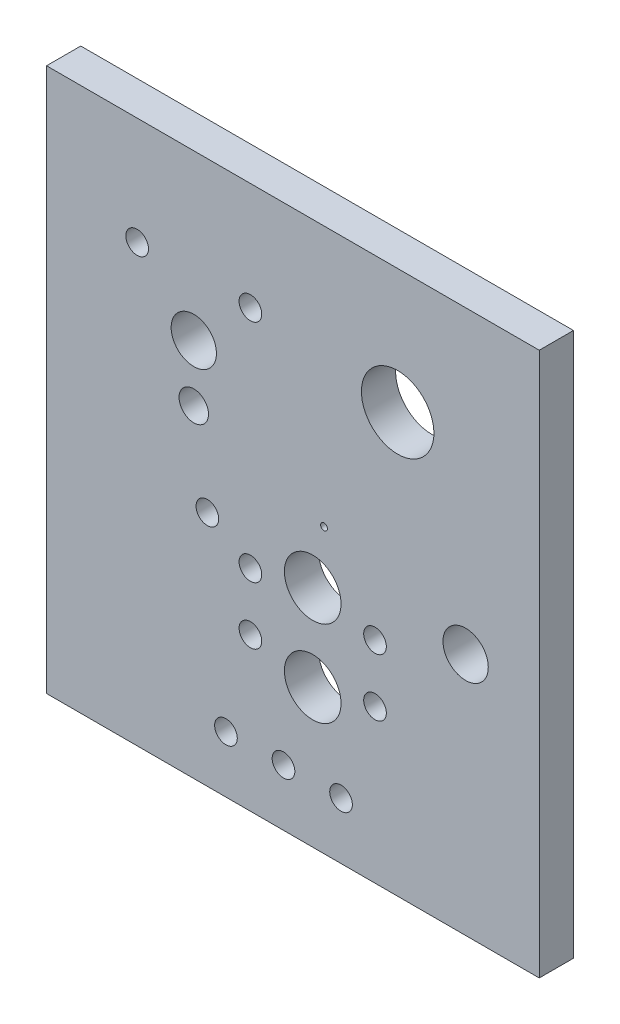
ISO-10303-21;
HEADER;
FILE_DESCRIPTION(('STEP AP214'),'2;1');
FILE_NAME('part.step','',(''),(''),'','','');
FILE_SCHEMA(('AUTOMOTIVE_DESIGN { 1 0 10303 214 1 1 1 1 }'));
ENDSEC;
DATA;
#1=APPLICATION_CONTEXT('core data for automotive mechanical design processes');
#2=APPLICATION_PROTOCOL_DEFINITION('international standard','automotive_design',2000,#1);
#3=PRODUCT_CONTEXT('',#1,'mechanical');
#4=PRODUCT('Part','Part','',(#3));
#5=PRODUCT_RELATED_PRODUCT_CATEGORY('part','',(#4));
#6=PRODUCT_DEFINITION_FORMATION('','',#4);
#7=PRODUCT_DEFINITION_CONTEXT('part definition',#1,'design');
#8=PRODUCT_DEFINITION('design','',#6,#7);
#9=PRODUCT_DEFINITION_SHAPE('','',#8);
#10=(LENGTH_UNIT() NAMED_UNIT(*) SI_UNIT(.MILLI.,.METRE.));
#11=(NAMED_UNIT(*) PLANE_ANGLE_UNIT() SI_UNIT($,.RADIAN.));
#12=(NAMED_UNIT(*) SI_UNIT($,.STERADIAN.) SOLID_ANGLE_UNIT());
#13=UNCERTAINTY_MEASURE_WITH_UNIT(LENGTH_MEASURE(1.E-05),#10,'distance_accuracy_value','');
#14=(GEOMETRIC_REPRESENTATION_CONTEXT(3) GLOBAL_UNCERTAINTY_ASSIGNED_CONTEXT((#13)) GLOBAL_UNIT_ASSIGNED_CONTEXT((#10,
#11,#12)) REPRESENTATION_CONTEXT('',''));
#15=CARTESIAN_POINT('',(0.,0.,0.));
#16=DIRECTION('',(0.,0.,1.));
#17=DIRECTION('',(1.,0.,0.));
#18=AXIS2_PLACEMENT_3D('',#15,#16,#17);
#19=CARTESIAN_POINT('',(155.5,-67.75,-0.046));
#20=DIRECTION('',(0.,0.,-1.));
#21=DIRECTION('',(0.,-1.,0.));
#22=AXIS2_PLACEMENT_3D('',#19,#20,#21);
#23=CYLINDRICAL_SURFACE('',#22,1.6);
#24=CARTESIAN_POINT('',(155.5,-67.75,0.));
#25=DIRECTION('',(0.,0.,-1.));
#26=DIRECTION('',(0.,-1.,0.));
#27=AXIS2_PLACEMENT_3D('',#24,#25,#26);
#28=CIRCLE('',#27,1.6);
#29=CARTESIAN_POINT('',(155.5,-69.35,0.));
#30=VERTEX_POINT('',#29);
#31=EDGE_CURVE('E402',#30,#30,#28,.T.);
#32=ORIENTED_EDGE('',*,*,#31,.T.);
#33=DIRECTION('',(0.,0.,1.));
#34=VECTOR('',#33,1.);
#35=CARTESIAN_POINT('',(155.5,-69.35,-0.046));
#36=LINE('',#35,#34);
#37=CARTESIAN_POINT('',(155.5,-69.35,1.51));
#38=VERTEX_POINT('',#37);
#39=EDGE_CURVE('E11',#30,#38,#36,.T.);
#40=ORIENTED_EDGE('',*,*,#39,.T.);
#41=CARTESIAN_POINT('',(155.5,-67.75,1.51));
#42=DIRECTION('',(0.,0.,-1.));
#43=DIRECTION('',(0.,-1.,0.));
#44=AXIS2_PLACEMENT_3D('',#41,#42,#43);
#45=CIRCLE('',#44,1.6);
#46=EDGE_CURVE('E326',#38,#38,#45,.T.);
#47=ORIENTED_EDGE('',*,*,#46,.F.);
#48=ORIENTED_EDGE('',*,*,#39,.F.);
#49=EDGE_LOOP('',(#32,#40,#47,#48));
#50=FACE_BOUND('',#49,.T.);
#51=ADVANCED_FACE('F16',(#50),#23,.F.);
#52=CARTESIAN_POINT('',(152.25,-73.75,-0.036));
#53=DIRECTION('',(0.,0.,-1.));
#54=DIRECTION('',(0.,-1.,0.));
#55=AXIS2_PLACEMENT_3D('',#52,#53,#54);
#56=CYLINDRICAL_SURFACE('',#55,0.15);
#57=CARTESIAN_POINT('',(152.25,-73.75,0.));
#58=DIRECTION('',(0.,0.,-1.));
#59=DIRECTION('',(0.,-1.,0.));
#60=AXIS2_PLACEMENT_3D('',#57,#58,#59);
#61=CIRCLE('',#60,0.15);
#62=CARTESIAN_POINT('',(152.25,-73.9,0.));
#63=VERTEX_POINT('',#62);
#64=EDGE_CURVE('E229',#63,#63,#61,.T.);
#65=ORIENTED_EDGE('',*,*,#64,.T.);
#66=DIRECTION('',(0.,0.,1.));
#67=VECTOR('',#66,1.);
#68=CARTESIAN_POINT('',(152.25,-73.9,-0.036));
#69=LINE('',#68,#67);
#70=CARTESIAN_POINT('',(152.25,-73.9,1.51));
#71=VERTEX_POINT('',#70);
#72=EDGE_CURVE('E27',#63,#71,#69,.T.);
#73=ORIENTED_EDGE('',*,*,#72,.T.);
#74=CARTESIAN_POINT('',(152.25,-73.75,1.51));
#75=DIRECTION('',(0.,0.,-1.));
#76=DIRECTION('',(0.,-1.,0.));
#77=AXIS2_PLACEMENT_3D('',#74,#75,#76);
#78=CIRCLE('',#77,0.15);
#79=EDGE_CURVE('E231',#71,#71,#78,.T.);
#80=ORIENTED_EDGE('',*,*,#79,.F.);
#81=ORIENTED_EDGE('',*,*,#72,.F.);
#82=EDGE_LOOP('',(#65,#73,#80,#81));
#83=FACE_BOUND('',#82,.T.);
#84=ADVANCED_FACE('F227',(#83),#56,.F.);
#85=CARTESIAN_POINT('',(149.,-67.,-0.046));
#86=DIRECTION('',(0.,0.,-1.));
#87=DIRECTION('',(0.,-1.,0.));
#88=AXIS2_PLACEMENT_3D('',#85,#86,#87);
#89=CYLINDRICAL_SURFACE('',#88,0.5);
#90=CARTESIAN_POINT('',(149.,-67.,0.));
#91=DIRECTION('',(0.,0.,-1.));
#92=DIRECTION('',(0.,-1.,0.));
#93=AXIS2_PLACEMENT_3D('',#90,#91,#92);
#94=CIRCLE('',#93,0.5);
#95=CARTESIAN_POINT('',(149.,-67.5,0.));
#96=VERTEX_POINT('',#95);
#97=EDGE_CURVE('E279',#96,#96,#94,.T.);
#98=ORIENTED_EDGE('',*,*,#97,.T.);
#99=DIRECTION('',(0.,0.,1.));
#100=VECTOR('',#99,1.);
#101=CARTESIAN_POINT('',(149.,-67.5,-0.046));
#102=LINE('',#101,#100);
#103=CARTESIAN_POINT('',(149.,-67.5,1.51));
#104=VERTEX_POINT('',#103);
#105=EDGE_CURVE('E233',#96,#104,#102,.T.);
#106=ORIENTED_EDGE('',*,*,#105,.T.);
#107=CARTESIAN_POINT('',(149.,-67.,1.51));
#108=DIRECTION('',(0.,0.,-1.));
#109=DIRECTION('',(0.,-1.,0.));
#110=AXIS2_PLACEMENT_3D('',#107,#108,#109);
#111=CIRCLE('',#110,0.5);
#112=EDGE_CURVE('E244',#104,#104,#111,.T.);
#113=ORIENTED_EDGE('',*,*,#112,.F.);
#114=ORIENTED_EDGE('',*,*,#105,.F.);
#115=EDGE_LOOP('',(#98,#106,#113,#114));
#116=FACE_BOUND('',#115,.T.);
#117=ADVANCED_FACE('F546',(#116),#89,.F.);
#118=CARTESIAN_POINT('',(144.,-67.,-0.046));
#119=DIRECTION('',(0.,0.,-1.));
#120=DIRECTION('',(0.,-1.,0.));
#121=AXIS2_PLACEMENT_3D('',#118,#119,#120);
#122=CYLINDRICAL_SURFACE('',#121,0.5);
#123=CARTESIAN_POINT('',(144.,-67.,0.));
#124=DIRECTION('',(0.,0.,-1.));
#125=DIRECTION('',(0.,-1.,0.));
#126=AXIS2_PLACEMENT_3D('',#123,#124,#125);
#127=CIRCLE('',#126,0.5);
#128=CARTESIAN_POINT('',(144.,-67.5,0.));
#129=VERTEX_POINT('',#128);
#130=EDGE_CURVE('E283',#129,#129,#127,.T.);
#131=ORIENTED_EDGE('',*,*,#130,.T.);
#132=DIRECTION('',(0.,0.,1.));
#133=VECTOR('',#132,1.);
#134=CARTESIAN_POINT('',(144.,-67.5,-0.046));
#135=LINE('',#134,#133);
#136=CARTESIAN_POINT('',(144.,-67.5,1.51));
#137=VERTEX_POINT('',#136);
#138=EDGE_CURVE('E131',#129,#137,#135,.T.);
#139=ORIENTED_EDGE('',*,*,#138,.T.);
#140=CARTESIAN_POINT('',(144.,-67.,1.51));
#141=DIRECTION('',(0.,0.,-1.));
#142=DIRECTION('',(0.,-1.,0.));
#143=AXIS2_PLACEMENT_3D('',#140,#141,#142);
#144=CIRCLE('',#143,0.5);
#145=EDGE_CURVE('E248',#137,#137,#144,.T.);
#146=ORIENTED_EDGE('',*,*,#145,.F.);
#147=ORIENTED_EDGE('',*,*,#138,.F.);
#148=EDGE_LOOP('',(#131,#139,#146,#147));
#149=FACE_BOUND('',#148,.T.);
#150=ADVANCED_FACE('F600',(#149),#122,.F.);
#151=CARTESIAN_POINT('',(146.5,-69.5,-0.046));
#152=DIRECTION('',(0.,0.,-1.));
#153=DIRECTION('',(0.,-1.,0.));
#154=AXIS2_PLACEMENT_3D('',#151,#152,#153);
#155=CYLINDRICAL_SURFACE('',#154,1.);
#156=CARTESIAN_POINT('',(146.5,-69.5,0.));
#157=DIRECTION('',(0.,0.,-1.));
#158=DIRECTION('',(0.,-1.,0.));
#159=AXIS2_PLACEMENT_3D('',#156,#157,#158);
#160=CIRCLE('',#159,1.);
#161=CARTESIAN_POINT('',(146.5,-70.5,0.));
#162=VERTEX_POINT('',#161);
#163=EDGE_CURVE('E323',#162,#162,#160,.T.);
#164=ORIENTED_EDGE('',*,*,#163,.T.);
#165=DIRECTION('',(0.,0.,1.));
#166=VECTOR('',#165,1.);
#167=CARTESIAN_POINT('',(146.5,-70.5,-0.046));
#168=LINE('',#167,#166);
#169=CARTESIAN_POINT('',(146.5,-70.5,1.51));
#170=VERTEX_POINT('',#169);
#171=EDGE_CURVE('E146',#162,#170,#168,.T.);
#172=ORIENTED_EDGE('',*,*,#171,.T.);
#173=CARTESIAN_POINT('',(146.5,-69.5,1.51));
#174=DIRECTION('',(0.,0.,-1.));
#175=DIRECTION('',(0.,-1.,0.));
#176=AXIS2_PLACEMENT_3D('',#173,#174,#175);
#177=CIRCLE('',#176,1.);
#178=EDGE_CURVE('E381',#170,#170,#177,.T.);
#179=ORIENTED_EDGE('',*,*,#178,.F.);
#180=ORIENTED_EDGE('',*,*,#171,.F.);
#181=EDGE_LOOP('',(#164,#172,#179,#180));
#182=FACE_BOUND('',#181,.T.);
#183=ADVANCED_FACE('F449',(#182),#155,.F.);
#184=CARTESIAN_POINT('',(146.5,-72.,-0.046));
#185=DIRECTION('',(0.,0.,-1.));
#186=DIRECTION('',(0.,-1.,0.));
#187=AXIS2_PLACEMENT_3D('',#184,#185,#186);
#188=CYLINDRICAL_SURFACE('',#187,0.65);
#189=CARTESIAN_POINT('',(146.5,-72.,0.));
#190=DIRECTION('',(0.,0.,-1.));
#191=DIRECTION('',(0.,-1.,0.));
#192=AXIS2_PLACEMENT_3D('',#189,#190,#191);
#193=CIRCLE('',#192,0.65);
#194=CARTESIAN_POINT('',(146.5,-72.65,0.));
#195=VERTEX_POINT('',#194);
#196=EDGE_CURVE('E320',#195,#195,#193,.T.);
#197=ORIENTED_EDGE('',*,*,#196,.T.);
#198=DIRECTION('',(0.,0.,1.));
#199=VECTOR('',#198,1.);
#200=CARTESIAN_POINT('',(146.5,-72.65,-0.046));
#201=LINE('',#200,#199);
#202=CARTESIAN_POINT('',(146.5,-72.65,1.51));
#203=VERTEX_POINT('',#202);
#204=EDGE_CURVE('E375',#195,#203,#201,.T.);
#205=ORIENTED_EDGE('',*,*,#204,.T.);
#206=CARTESIAN_POINT('',(146.5,-72.,1.51));
#207=DIRECTION('',(0.,0.,-1.));
#208=DIRECTION('',(0.,-1.,0.));
#209=AXIS2_PLACEMENT_3D('',#206,#207,#208);
#210=CIRCLE('',#209,0.65);
#211=EDGE_CURVE('E277',#203,#203,#210,.T.);
#212=ORIENTED_EDGE('',*,*,#211,.F.);
#213=ORIENTED_EDGE('',*,*,#204,.F.);
#214=EDGE_LOOP('',(#197,#205,#212,#213));
#215=FACE_BOUND('',#214,.T.);
#216=ADVANCED_FACE('F567',(#215),#188,.F.);
#217=CARTESIAN_POINT('',(158.5,-75.5,-0.046));
#218=DIRECTION('',(0.,0.,-1.));
#219=DIRECTION('',(0.,-1.,0.));
#220=AXIS2_PLACEMENT_3D('',#217,#218,#219);
#221=CYLINDRICAL_SURFACE('',#220,1.);
#222=CARTESIAN_POINT('',(158.5,-75.5,0.));
#223=DIRECTION('',(0.,0.,-1.));
#224=DIRECTION('',(0.,-1.,0.));
#225=AXIS2_PLACEMENT_3D('',#222,#223,#224);
#226=CIRCLE('',#225,1.);
#227=CARTESIAN_POINT('',(158.5,-76.5,0.));
#228=VERTEX_POINT('',#227);
#229=EDGE_CURVE('E324',#228,#228,#226,.T.);
#230=ORIENTED_EDGE('',*,*,#229,.T.);
#231=DIRECTION('',(0.,0.,1.));
#232=VECTOR('',#231,1.);
#233=CARTESIAN_POINT('',(158.5,-76.5,-0.046));
#234=LINE('',#233,#232);
#235=CARTESIAN_POINT('',(158.5,-76.5,1.51));
#236=VERTEX_POINT('',#235);
#237=EDGE_CURVE('E372',#228,#236,#234,.T.);
#238=ORIENTED_EDGE('',*,*,#237,.T.);
#239=CARTESIAN_POINT('',(158.5,-75.5,1.51));
#240=DIRECTION('',(0.,0.,-1.));
#241=DIRECTION('',(0.,-1.,0.));
#242=AXIS2_PLACEMENT_3D('',#239,#240,#241);
#243=CIRCLE('',#242,1.);
#244=EDGE_CURVE('E273',#236,#236,#243,.T.);
#245=ORIENTED_EDGE('',*,*,#244,.F.);
#246=ORIENTED_EDGE('',*,*,#237,.F.);
#247=EDGE_LOOP('',(#230,#238,#245,#246));
#248=FACE_BOUND('',#247,.T.);
#249=ADVANCED_FACE('F505',(#248),#221,.F.);
#250=CARTESIAN_POINT('',(154.5,-76.96,-0.046));
#251=DIRECTION('',(0.,0.,-1.));
#252=DIRECTION('',(0.,-1.,0.));
#253=AXIS2_PLACEMENT_3D('',#250,#251,#252);
#254=CYLINDRICAL_SURFACE('',#253,0.5);
#255=CARTESIAN_POINT('',(154.5,-76.96,0.));
#256=DIRECTION('',(0.,0.,-1.));
#257=DIRECTION('',(0.,-1.,0.));
#258=AXIS2_PLACEMENT_3D('',#255,#256,#257);
#259=CIRCLE('',#258,0.5);
#260=CARTESIAN_POINT('',(154.5,-77.46,0.));
#261=VERTEX_POINT('',#260);
#262=EDGE_CURVE('E288',#261,#261,#259,.T.);
#263=ORIENTED_EDGE('',*,*,#262,.T.);
#264=DIRECTION('',(0.,0.,1.));
#265=VECTOR('',#264,1.);
#266=CARTESIAN_POINT('',(154.5,-77.46,-0.046));
#267=LINE('',#266,#265);
#268=CARTESIAN_POINT('',(154.5,-77.46,1.51));
#269=VERTEX_POINT('',#268);
#270=EDGE_CURVE('E367',#261,#269,#267,.T.);
#271=ORIENTED_EDGE('',*,*,#270,.T.);
#272=CARTESIAN_POINT('',(154.5,-76.96,1.51));
#273=DIRECTION('',(0.,0.,-1.));
#274=DIRECTION('',(0.,-1.,0.));
#275=AXIS2_PLACEMENT_3D('',#272,#273,#274);
#276=CIRCLE('',#275,0.5);
#277=EDGE_CURVE('E278',#269,#269,#276,.T.);
#278=ORIENTED_EDGE('',*,*,#277,.F.);
#279=ORIENTED_EDGE('',*,*,#270,.F.);
#280=EDGE_LOOP('',(#263,#271,#278,#279));
#281=FACE_BOUND('',#280,.T.);
#282=ADVANCED_FACE('F556',(#281),#254,.F.);
#283=CARTESIAN_POINT('',(151.75,-76.33,-0.046));
#284=DIRECTION('',(0.,0.,-1.));
#285=DIRECTION('',(0.,-1.,0.));
#286=AXIS2_PLACEMENT_3D('',#283,#284,#285);
#287=CYLINDRICAL_SURFACE('',#286,1.25);
#288=CARTESIAN_POINT('',(151.75,-76.33,0.));
#289=DIRECTION('',(0.,0.,-1.));
#290=DIRECTION('',(0.,-1.,0.));
#291=AXIS2_PLACEMENT_3D('',#288,#289,#290);
#292=CIRCLE('',#291,1.25);
#293=CARTESIAN_POINT('',(151.75,-77.58,0.));
#294=VERTEX_POINT('',#293);
#295=EDGE_CURVE('E284',#294,#294,#292,.T.);
#296=ORIENTED_EDGE('',*,*,#295,.T.);
#297=DIRECTION('',(0.,0.,1.));
#298=VECTOR('',#297,1.);
#299=CARTESIAN_POINT('',(151.75,-77.58,-0.046));
#300=LINE('',#299,#298);
#301=CARTESIAN_POINT('',(151.75,-77.58,1.51));
#302=VERTEX_POINT('',#301);
#303=EDGE_CURVE('E363',#294,#302,#300,.T.);
#304=ORIENTED_EDGE('',*,*,#303,.T.);
#305=CARTESIAN_POINT('',(151.75,-76.33,1.51));
#306=DIRECTION('',(0.,0.,-1.));
#307=DIRECTION('',(0.,-1.,0.));
#308=AXIS2_PLACEMENT_3D('',#305,#306,#307);
#309=CIRCLE('',#308,1.25);
#310=EDGE_CURVE('E300',#302,#302,#309,.T.);
#311=ORIENTED_EDGE('',*,*,#310,.F.);
#312=ORIENTED_EDGE('',*,*,#303,.F.);
#313=EDGE_LOOP('',(#296,#304,#311,#312));
#314=FACE_BOUND('',#313,.T.);
#315=ADVANCED_FACE('F558',(#314),#287,.F.);
#316=CARTESIAN_POINT('',(154.5,-79.5,-0.046));
#317=DIRECTION('',(0.,0.,-1.));
#318=DIRECTION('',(0.,-1.,0.));
#319=AXIS2_PLACEMENT_3D('',#316,#317,#318);
#320=CYLINDRICAL_SURFACE('',#319,0.5);
#321=CARTESIAN_POINT('',(154.5,-79.5,0.));
#322=DIRECTION('',(0.,0.,-1.));
#323=DIRECTION('',(0.,-1.,0.));
#324=AXIS2_PLACEMENT_3D('',#321,#322,#323);
#325=CIRCLE('',#324,0.5);
#326=CARTESIAN_POINT('',(154.5,-80.,0.));
#327=VERTEX_POINT('',#326);
#328=EDGE_CURVE('E255',#327,#327,#325,.T.);
#329=ORIENTED_EDGE('',*,*,#328,.T.);
#330=DIRECTION('',(0.,0.,1.));
#331=VECTOR('',#330,1.);
#332=CARTESIAN_POINT('',(154.5,-80.,-0.046));
#333=LINE('',#332,#331);
#334=CARTESIAN_POINT('',(154.5,-80.,1.51));
#335=VERTEX_POINT('',#334);
#336=EDGE_CURVE('E359',#327,#335,#333,.T.);
#337=ORIENTED_EDGE('',*,*,#336,.T.);
#338=CARTESIAN_POINT('',(154.5,-79.5,1.51));
#339=DIRECTION('',(0.,0.,-1.));
#340=DIRECTION('',(0.,-1.,0.));
#341=AXIS2_PLACEMENT_3D('',#338,#339,#340);
#342=CIRCLE('',#341,0.5);
#343=EDGE_CURVE('E296',#335,#335,#342,.T.);
#344=ORIENTED_EDGE('',*,*,#343,.F.);
#345=ORIENTED_EDGE('',*,*,#336,.F.);
#346=EDGE_LOOP('',(#329,#337,#344,#345));
#347=FACE_BOUND('',#346,.T.);
#348=ADVANCED_FACE('F554',(#347),#320,.F.);
#349=CARTESIAN_POINT('',(151.75,-80.13,-0.046));
#350=DIRECTION('',(0.,0.,-1.));
#351=DIRECTION('',(0.,-1.,0.));
#352=AXIS2_PLACEMENT_3D('',#349,#350,#351);
#353=CYLINDRICAL_SURFACE('',#352,1.25);
#354=CARTESIAN_POINT('',(151.75,-80.13,0.));
#355=DIRECTION('',(0.,0.,-1.));
#356=DIRECTION('',(0.,-1.,0.));
#357=AXIS2_PLACEMENT_3D('',#354,#355,#356);
#358=CIRCLE('',#357,1.25);
#359=CARTESIAN_POINT('',(151.75,-81.38,0.));
#360=VERTEX_POINT('',#359);
#361=EDGE_CURVE('E252',#360,#360,#358,.T.);
#362=ORIENTED_EDGE('',*,*,#361,.T.);
#363=DIRECTION('',(0.,0.,1.));
#364=VECTOR('',#363,1.);
#365=CARTESIAN_POINT('',(151.75,-81.38,-0.046));
#366=LINE('',#365,#364);
#367=CARTESIAN_POINT('',(151.75,-81.38,1.51));
#368=VERTEX_POINT('',#367);
#369=EDGE_CURVE('E364',#360,#368,#366,.T.);
#370=ORIENTED_EDGE('',*,*,#369,.T.);
#371=CARTESIAN_POINT('',(151.75,-80.13,1.51));
#372=DIRECTION('',(0.,0.,-1.));
#373=DIRECTION('',(0.,-1.,0.));
#374=AXIS2_PLACEMENT_3D('',#371,#372,#373);
#375=CIRCLE('',#374,1.25);
#376=EDGE_CURVE('E242',#368,#368,#375,.T.);
#377=ORIENTED_EDGE('',*,*,#376,.F.);
#378=ORIENTED_EDGE('',*,*,#369,.F.);
#379=EDGE_LOOP('',(#362,#370,#377,#378));
#380=FACE_BOUND('',#379,.T.);
#381=ADVANCED_FACE('F551',(#380),#353,.F.);
#382=CARTESIAN_POINT('',(153.,-83.75,-0.046));
#383=DIRECTION('',(0.,0.,-1.));
#384=DIRECTION('',(0.,-1.,0.));
#385=AXIS2_PLACEMENT_3D('',#382,#383,#384);
#386=CYLINDRICAL_SURFACE('',#385,0.5);
#387=CARTESIAN_POINT('',(153.,-83.75,0.));
#388=DIRECTION('',(0.,0.,-1.));
#389=DIRECTION('',(0.,-1.,0.));
#390=AXIS2_PLACEMENT_3D('',#387,#388,#389);
#391=CIRCLE('',#390,0.5);
#392=CARTESIAN_POINT('',(153.,-84.25,0.));
#393=VERTEX_POINT('',#392);
#394=EDGE_CURVE('E256',#393,#393,#391,.T.);
#395=ORIENTED_EDGE('',*,*,#394,.T.);
#396=DIRECTION('',(0.,0.,1.));
#397=VECTOR('',#396,1.);
#398=CARTESIAN_POINT('',(153.,-84.25,-0.046));
#399=LINE('',#398,#397);
#400=CARTESIAN_POINT('',(153.,-84.25,1.51));
#401=VERTEX_POINT('',#400);
#402=EDGE_CURVE('E408',#393,#401,#399,.T.);
#403=ORIENTED_EDGE('',*,*,#402,.T.);
#404=CARTESIAN_POINT('',(153.,-83.75,1.51));
#405=DIRECTION('',(0.,0.,-1.));
#406=DIRECTION('',(0.,-1.,0.));
#407=AXIS2_PLACEMENT_3D('',#404,#405,#406);
#408=CIRCLE('',#407,0.5);
#409=EDGE_CURVE('E295',#401,#401,#408,.T.);
#410=ORIENTED_EDGE('',*,*,#409,.F.);
#411=ORIENTED_EDGE('',*,*,#402,.F.);
#412=EDGE_LOOP('',(#395,#403,#410,#411));
#413=FACE_BOUND('',#412,.T.);
#414=ADVANCED_FACE('F553',(#413),#386,.F.);
#415=CARTESIAN_POINT('',(149.,-76.96,-0.046));
#416=DIRECTION('',(0.,0.,-1.));
#417=DIRECTION('',(0.,-1.,0.));
#418=AXIS2_PLACEMENT_3D('',#415,#416,#417);
#419=CYLINDRICAL_SURFACE('',#418,0.5);
#420=CARTESIAN_POINT('',(149.,-76.96,0.));
#421=DIRECTION('',(0.,0.,-1.));
#422=DIRECTION('',(0.,-1.,0.));
#423=AXIS2_PLACEMENT_3D('',#420,#421,#422);
#424=CIRCLE('',#423,0.5);
#425=CARTESIAN_POINT('',(149.,-77.46,0.));
#426=VERTEX_POINT('',#425);
#427=EDGE_CURVE('E350',#426,#426,#424,.T.);
#428=ORIENTED_EDGE('',*,*,#427,.T.);
#429=DIRECTION('',(0.,0.,1.));
#430=VECTOR('',#429,1.);
#431=CARTESIAN_POINT('',(149.,-77.46,-0.046));
#432=LINE('',#431,#430);
#433=CARTESIAN_POINT('',(149.,-77.46,1.51));
#434=VERTEX_POINT('',#433);
#435=EDGE_CURVE('E291',#426,#434,#432,.T.);
#436=ORIENTED_EDGE('',*,*,#435,.T.);
#437=CARTESIAN_POINT('',(149.,-76.96,1.51));
#438=DIRECTION('',(0.,0.,-1.));
#439=DIRECTION('',(0.,-1.,0.));
#440=AXIS2_PLACEMENT_3D('',#437,#438,#439);
#441=CIRCLE('',#440,0.5);
#442=EDGE_CURVE('E262',#434,#434,#441,.T.);
#443=ORIENTED_EDGE('',*,*,#442,.F.);
#444=ORIENTED_EDGE('',*,*,#435,.F.);
#445=EDGE_LOOP('',(#428,#436,#443,#444));
#446=FACE_BOUND('',#445,.T.);
#447=ADVANCED_FACE('F587',(#446),#419,.F.);
#448=CARTESIAN_POINT('',(149.,-79.5,-0.046));
#449=DIRECTION('',(0.,0.,-1.));
#450=DIRECTION('',(0.,-1.,0.));
#451=AXIS2_PLACEMENT_3D('',#448,#449,#450);
#452=CYLINDRICAL_SURFACE('',#451,0.5);
#453=CARTESIAN_POINT('',(149.,-79.5,0.));
#454=DIRECTION('',(0.,0.,-1.));
#455=DIRECTION('',(0.,-1.,0.));
#456=AXIS2_PLACEMENT_3D('',#453,#454,#455);
#457=CIRCLE('',#456,0.5);
#458=CARTESIAN_POINT('',(149.,-80.,0.));
#459=VERTEX_POINT('',#458);
#460=EDGE_CURVE('E347',#459,#459,#457,.T.);
#461=ORIENTED_EDGE('',*,*,#460,.T.);
#462=DIRECTION('',(0.,0.,1.));
#463=VECTOR('',#462,1.);
#464=CARTESIAN_POINT('',(149.,-80.,-0.046));
#465=LINE('',#464,#463);
#466=CARTESIAN_POINT('',(149.,-80.,1.51));
#467=VERTEX_POINT('',#466);
#468=EDGE_CURVE('E186',#459,#467,#465,.T.);
#469=ORIENTED_EDGE('',*,*,#468,.T.);
#470=CARTESIAN_POINT('',(149.,-79.5,1.51));
#471=DIRECTION('',(0.,0.,-1.));
#472=DIRECTION('',(0.,-1.,0.));
#473=AXIS2_PLACEMENT_3D('',#470,#471,#472);
#474=CIRCLE('',#473,0.5);
#475=EDGE_CURVE('E258',#467,#467,#474,.T.);
#476=ORIENTED_EDGE('',*,*,#475,.F.);
#477=ORIENTED_EDGE('',*,*,#468,.F.);
#478=EDGE_LOOP('',(#461,#469,#476,#477));
#479=FACE_BOUND('',#478,.T.);
#480=ADVANCED_FACE('F580',(#479),#452,.F.);
#481=CARTESIAN_POINT('',(147.1,-75.78,-0.046));
#482=DIRECTION('',(0.,0.,-1.));
#483=DIRECTION('',(0.,-1.,0.));
#484=AXIS2_PLACEMENT_3D('',#481,#482,#483);
#485=CYLINDRICAL_SURFACE('',#484,0.5);
#486=CARTESIAN_POINT('',(147.1,-75.78,0.));
#487=DIRECTION('',(0.,0.,-1.));
#488=DIRECTION('',(0.,-1.,0.));
#489=AXIS2_PLACEMENT_3D('',#486,#487,#488);
#490=CIRCLE('',#489,0.5);
#491=CARTESIAN_POINT('',(147.1,-76.28,0.));
#492=VERTEX_POINT('',#491);
#493=EDGE_CURVE('E351',#492,#492,#490,.T.);
#494=ORIENTED_EDGE('',*,*,#493,.T.);
#495=DIRECTION('',(0.,0.,1.));
#496=VECTOR('',#495,1.);
#497=CARTESIAN_POINT('',(147.1,-76.28,-0.046));
#498=LINE('',#497,#496);
#499=CARTESIAN_POINT('',(147.1,-76.28,1.51));
#500=VERTEX_POINT('',#499);
#501=EDGE_CURVE('E20',#492,#500,#498,.T.);
#502=ORIENTED_EDGE('',*,*,#501,.T.);
#503=CARTESIAN_POINT('',(147.1,-75.78,1.51));
#504=DIRECTION('',(0.,0.,-1.));
#505=DIRECTION('',(0.,-1.,0.));
#506=AXIS2_PLACEMENT_3D('',#503,#504,#505);
#507=CIRCLE('',#506,0.5);
#508=EDGE_CURVE('E263',#500,#500,#507,.T.);
#509=ORIENTED_EDGE('',*,*,#508,.F.);
#510=ORIENTED_EDGE('',*,*,#501,.F.);
#511=EDGE_LOOP('',(#494,#502,#509,#510));
#512=FACE_BOUND('',#511,.T.);
#513=ADVANCED_FACE('F577',(#512),#485,.F.);
#514=CARTESIAN_POINT('',(150.46,-83.75,-0.046));
#515=DIRECTION('',(0.,0.,-1.));
#516=DIRECTION('',(0.,-1.,0.));
#517=AXIS2_PLACEMENT_3D('',#514,#515,#516);
#518=CYLINDRICAL_SURFACE('',#517,0.5);
#519=CARTESIAN_POINT('',(150.46,-83.75,0.));
#520=DIRECTION('',(0.,0.,-1.));
#521=DIRECTION('',(0.,-1.,0.));
#522=AXIS2_PLACEMENT_3D('',#519,#520,#521);
#523=CIRCLE('',#522,0.5);
#524=CARTESIAN_POINT('',(150.46,-84.25,0.));
#525=VERTEX_POINT('',#524);
#526=EDGE_CURVE('E355',#525,#525,#523,.T.);
#527=ORIENTED_EDGE('',*,*,#526,.T.);
#528=DIRECTION('',(0.,0.,1.));
#529=VECTOR('',#528,1.);
#530=CARTESIAN_POINT('',(150.46,-84.25,-0.046));
#531=LINE('',#530,#529);
#532=CARTESIAN_POINT('',(150.46,-84.25,1.51));
#533=VERTEX_POINT('',#532);
#534=EDGE_CURVE('E74',#525,#533,#531,.T.);
#535=ORIENTED_EDGE('',*,*,#534,.T.);
#536=CARTESIAN_POINT('',(150.46,-83.75,1.51));
#537=DIRECTION('',(0.,0.,-1.));
#538=DIRECTION('',(0.,-1.,0.));
#539=AXIS2_PLACEMENT_3D('',#536,#537,#538);
#540=CIRCLE('',#539,0.5);
#541=EDGE_CURVE('E272',#533,#533,#540,.T.);
#542=ORIENTED_EDGE('',*,*,#541,.F.);
#543=ORIENTED_EDGE('',*,*,#534,.F.);
#544=EDGE_LOOP('',(#527,#535,#542,#543));
#545=FACE_BOUND('',#544,.T.);
#546=ADVANCED_FACE('F579',(#545),#518,.F.);
#547=CARTESIAN_POINT('',(147.92,-83.75,-0.046));
#548=DIRECTION('',(0.,0.,-1.));
#549=DIRECTION('',(0.,-1.,0.));
#550=AXIS2_PLACEMENT_3D('',#547,#548,#549);
#551=CYLINDRICAL_SURFACE('',#550,0.5);
#552=CARTESIAN_POINT('',(147.92,-83.75,0.));
#553=DIRECTION('',(0.,0.,-1.));
#554=DIRECTION('',(0.,-1.,0.));
#555=AXIS2_PLACEMENT_3D('',#552,#553,#554);
#556=CIRCLE('',#555,0.5);
#557=CARTESIAN_POINT('',(147.92,-84.25,0.));
#558=VERTEX_POINT('',#557);
#559=EDGE_CURVE('E358',#558,#558,#556,.T.);
#560=ORIENTED_EDGE('',*,*,#559,.T.);
#561=DIRECTION('',(0.,0.,1.));
#562=VECTOR('',#561,1.);
#563=CARTESIAN_POINT('',(147.92,-84.25,-0.046));
#564=LINE('',#563,#562);
#565=CARTESIAN_POINT('',(147.92,-84.25,1.51));
#566=VERTEX_POINT('',#565);
#567=EDGE_CURVE('E251',#558,#566,#564,.T.);
#568=ORIENTED_EDGE('',*,*,#567,.T.);
#569=CARTESIAN_POINT('',(147.92,-83.75,1.51));
#570=DIRECTION('',(0.,0.,-1.));
#571=DIRECTION('',(0.,-1.,0.));
#572=AXIS2_PLACEMENT_3D('',#569,#570,#571);
#573=CIRCLE('',#572,0.5);
#574=EDGE_CURVE('E301',#566,#566,#573,.T.);
#575=ORIENTED_EDGE('',*,*,#574,.F.);
#576=ORIENTED_EDGE('',*,*,#567,.F.);
#577=EDGE_LOOP('',(#560,#568,#575,#576));
#578=FACE_BOUND('',#577,.T.);
#579=ADVANCED_FACE('F586',(#578),#551,.F.);
#580=CARTESIAN_POINT('',(140.,-62.25,0.));
#581=DIRECTION('',(0.,1.,0.));
#582=DIRECTION('',(1.,0.,0.));
#583=AXIS2_PLACEMENT_3D('',#580,#581,#582);
#584=PLANE('',#583);
#585=DIRECTION('',(0.,0.,1.));
#586=VECTOR('',#585,1.);
#587=CARTESIAN_POINT('',(140.,-62.25,0.));
#588=LINE('',#587,#586);
#589=CARTESIAN_POINT('',(140.,-62.25,0.));
#590=VERTEX_POINT('',#589);
#591=CARTESIAN_POINT('',(140.,-62.25,1.51));
#592=VERTEX_POINT('',#591);
#593=EDGE_CURVE('E318',#590,#592,#588,.T.);
#594=ORIENTED_EDGE('',*,*,#593,.T.);
#595=DIRECTION('',(1.,0.,0.));
#596=VECTOR('',#595,1.);
#597=CARTESIAN_POINT('',(140.,-62.25,1.51));
#598=LINE('',#597,#596);
#599=CARTESIAN_POINT('',(161.75,-62.25,1.51));
#600=VERTEX_POINT('',#599);
#601=EDGE_CURVE('E305',#592,#600,#598,.T.);
#602=ORIENTED_EDGE('',*,*,#601,.T.);
#603=DIRECTION('',(0.,0.,1.));
#604=VECTOR('',#603,1.);
#605=CARTESIAN_POINT('',(161.75,-62.25,0.));
#606=LINE('',#605,#604);
#607=CARTESIAN_POINT('',(161.75,-62.25,0.));
#608=VERTEX_POINT('',#607);
#609=EDGE_CURVE('E268',#608,#600,#606,.T.);
#610=ORIENTED_EDGE('',*,*,#609,.F.);
#611=DIRECTION('',(1.,0.,0.));
#612=VECTOR('',#611,1.);
#613=CARTESIAN_POINT('',(140.,-62.25,0.));
#614=LINE('',#613,#612);
#615=EDGE_CURVE('E346',#590,#608,#614,.T.);
#616=ORIENTED_EDGE('',*,*,#615,.F.);
#617=EDGE_LOOP('',(#594,#602,#610,#616));
#618=FACE_BOUND('',#617,.T.);
#619=ADVANCED_FACE('F488',(#618),#584,.T.);
#620=CARTESIAN_POINT('',(0.,0.,1.51));
#621=DIRECTION('',(0.,0.,1.));
#622=DIRECTION('',(1.,0.,0.));
#623=AXIS2_PLACEMENT_3D('',#620,#621,#622);
#624=PLANE('',#623);
#625=ORIENTED_EDGE('',*,*,#46,.T.);
#626=EDGE_LOOP('',(#625));
#627=FACE_BOUND('',#626,.T.);
#628=ORIENTED_EDGE('',*,*,#79,.T.);
#629=EDGE_LOOP('',(#628));
#630=FACE_BOUND('',#629,.T.);
#631=ORIENTED_EDGE('',*,*,#112,.T.);
#632=EDGE_LOOP('',(#631));
#633=FACE_BOUND('',#632,.T.);
#634=ORIENTED_EDGE('',*,*,#145,.T.);
#635=EDGE_LOOP('',(#634));
#636=FACE_BOUND('',#635,.T.);
#637=ORIENTED_EDGE('',*,*,#178,.T.);
#638=EDGE_LOOP('',(#637));
#639=FACE_BOUND('',#638,.T.);
#640=ORIENTED_EDGE('',*,*,#211,.T.);
#641=EDGE_LOOP('',(#640));
#642=FACE_BOUND('',#641,.T.);
#643=ORIENTED_EDGE('',*,*,#244,.T.);
#644=EDGE_LOOP('',(#643));
#645=FACE_BOUND('',#644,.T.);
#646=ORIENTED_EDGE('',*,*,#277,.T.);
#647=EDGE_LOOP('',(#646));
#648=FACE_BOUND('',#647,.T.);
#649=ORIENTED_EDGE('',*,*,#310,.T.);
#650=EDGE_LOOP('',(#649));
#651=FACE_BOUND('',#650,.T.);
#652=ORIENTED_EDGE('',*,*,#343,.T.);
#653=EDGE_LOOP('',(#652));
#654=FACE_BOUND('',#653,.T.);
#655=ORIENTED_EDGE('',*,*,#376,.T.);
#656=EDGE_LOOP('',(#655));
#657=FACE_BOUND('',#656,.T.);
#658=ORIENTED_EDGE('',*,*,#409,.T.);
#659=EDGE_LOOP('',(#658));
#660=FACE_BOUND('',#659,.T.);
#661=ORIENTED_EDGE('',*,*,#442,.T.);
#662=EDGE_LOOP('',(#661));
#663=FACE_BOUND('',#662,.T.);
#664=ORIENTED_EDGE('',*,*,#475,.T.);
#665=EDGE_LOOP('',(#664));
#666=FACE_BOUND('',#665,.T.);
#667=ORIENTED_EDGE('',*,*,#508,.T.);
#668=EDGE_LOOP('',(#667));
#669=FACE_BOUND('',#668,.T.);
#670=ORIENTED_EDGE('',*,*,#541,.T.);
#671=EDGE_LOOP('',(#670));
#672=FACE_BOUND('',#671,.T.);
#673=ORIENTED_EDGE('',*,*,#574,.T.);
#674=EDGE_LOOP('',(#673));
#675=FACE_BOUND('',#674,.T.);
#676=DIRECTION('',(-1.,0.,0.));
#677=VECTOR('',#676,1.);
#678=CARTESIAN_POINT('',(161.75,-86.25,1.51));
#679=LINE('',#678,#677);
#680=CARTESIAN_POINT('',(161.75,-86.25,1.51));
#681=VERTEX_POINT('',#680);
#682=CARTESIAN_POINT('',(140.,-86.25,1.51));
#683=VERTEX_POINT('',#682);
#684=EDGE_CURVE('E306',#681,#683,#679,.T.);
#685=ORIENTED_EDGE('',*,*,#684,.F.);
#686=DIRECTION('',(0.,-1.,0.));
#687=VECTOR('',#686,1.);
#688=CARTESIAN_POINT('',(161.75,-62.25,1.51));
#689=LINE('',#688,#687);
#690=EDGE_CURVE('E371',#600,#681,#689,.T.);
#691=ORIENTED_EDGE('',*,*,#690,.F.);
#692=ORIENTED_EDGE('',*,*,#601,.F.);
#693=DIRECTION('',(0.,1.,0.));
#694=VECTOR('',#693,1.);
#695=CARTESIAN_POINT('',(140.,-86.25,1.51));
#696=LINE('',#695,#694);
#697=EDGE_CURVE('E314',#683,#592,#696,.T.);
#698=ORIENTED_EDGE('',*,*,#697,.F.);
#699=EDGE_LOOP('',(#685,#691,#692,#698));
#700=FACE_BOUND('',#699,.T.);
#701=ADVANCED_FACE('F18',(#627,#630,#633,#636,#639,#642,#645,#648,#651,#654,#657,#660,#663,#666,
#669,#672,#675,#700),#624,.T.);
#702=CARTESIAN_POINT('',(0.,0.,0.));
#703=DIRECTION('',(0.,0.,1.));
#704=DIRECTION('',(1.,0.,0.));
#705=AXIS2_PLACEMENT_3D('',#702,#703,#704);
#706=PLANE('',#705);
#707=ORIENTED_EDGE('',*,*,#31,.F.);
#708=EDGE_LOOP('',(#707));
#709=FACE_BOUND('',#708,.T.);
#710=ORIENTED_EDGE('',*,*,#64,.F.);
#711=EDGE_LOOP('',(#710));
#712=FACE_BOUND('',#711,.T.);
#713=ORIENTED_EDGE('',*,*,#97,.F.);
#714=EDGE_LOOP('',(#713));
#715=FACE_BOUND('',#714,.T.);
#716=ORIENTED_EDGE('',*,*,#130,.F.);
#717=EDGE_LOOP('',(#716));
#718=FACE_BOUND('',#717,.T.);
#719=ORIENTED_EDGE('',*,*,#163,.F.);
#720=EDGE_LOOP('',(#719));
#721=FACE_BOUND('',#720,.T.);
#722=ORIENTED_EDGE('',*,*,#196,.F.);
#723=EDGE_LOOP('',(#722));
#724=FACE_BOUND('',#723,.T.);
#725=ORIENTED_EDGE('',*,*,#229,.F.);
#726=EDGE_LOOP('',(#725));
#727=FACE_BOUND('',#726,.T.);
#728=ORIENTED_EDGE('',*,*,#262,.F.);
#729=EDGE_LOOP('',(#728));
#730=FACE_BOUND('',#729,.T.);
#731=ORIENTED_EDGE('',*,*,#295,.F.);
#732=EDGE_LOOP('',(#731));
#733=FACE_BOUND('',#732,.T.);
#734=ORIENTED_EDGE('',*,*,#328,.F.);
#735=EDGE_LOOP('',(#734));
#736=FACE_BOUND('',#735,.T.);
#737=ORIENTED_EDGE('',*,*,#361,.F.);
#738=EDGE_LOOP('',(#737));
#739=FACE_BOUND('',#738,.T.);
#740=ORIENTED_EDGE('',*,*,#394,.F.);
#741=EDGE_LOOP('',(#740));
#742=FACE_BOUND('',#741,.T.);
#743=ORIENTED_EDGE('',*,*,#427,.F.);
#744=EDGE_LOOP('',(#743));
#745=FACE_BOUND('',#744,.T.);
#746=ORIENTED_EDGE('',*,*,#460,.F.);
#747=EDGE_LOOP('',(#746));
#748=FACE_BOUND('',#747,.T.);
#749=ORIENTED_EDGE('',*,*,#493,.F.);
#750=EDGE_LOOP('',(#749));
#751=FACE_BOUND('',#750,.T.);
#752=ORIENTED_EDGE('',*,*,#526,.F.);
#753=EDGE_LOOP('',(#752));
#754=FACE_BOUND('',#753,.T.);
#755=ORIENTED_EDGE('',*,*,#559,.F.);
#756=EDGE_LOOP('',(#755));
#757=FACE_BOUND('',#756,.T.);
#758=DIRECTION('',(0.,1.,0.));
#759=VECTOR('',#758,1.);
#760=CARTESIAN_POINT('',(140.,-86.25,0.));
#761=LINE('',#760,#759);
#762=CARTESIAN_POINT('',(140.,-86.25,0.));
#763=VERTEX_POINT('',#762);
#764=EDGE_CURVE('E342',#763,#590,#761,.T.);
#765=ORIENTED_EDGE('',*,*,#764,.T.);
#766=ORIENTED_EDGE('',*,*,#615,.T.);
#767=DIRECTION('',(0.,-1.,0.));
#768=VECTOR('',#767,1.);
#769=CARTESIAN_POINT('',(161.75,-62.25,0.));
#770=LINE('',#769,#768);
#771=CARTESIAN_POINT('',(161.75,-86.25,0.));
#772=VERTEX_POINT('',#771);
#773=EDGE_CURVE('E319',#608,#772,#770,.T.);
#774=ORIENTED_EDGE('',*,*,#773,.T.);
#775=DIRECTION('',(-1.,0.,0.));
#776=VECTOR('',#775,1.);
#777=CARTESIAN_POINT('',(161.75,-86.25,0.));
#778=LINE('',#777,#776);
#779=EDGE_CURVE('E264',#772,#763,#778,.T.);
#780=ORIENTED_EDGE('',*,*,#779,.T.);
#781=EDGE_LOOP('',(#765,#766,#774,#780));
#782=FACE_BOUND('',#781,.T.);
#783=ADVANCED_FACE('F452',(#709,#712,#715,#718,#721,#724,#727,#730,#733,#736,#739,#742,#745,
#748,#751,#754,#757,#782),#706,.F.);
#784=CARTESIAN_POINT('',(140.,-86.25,0.));
#785=DIRECTION('',(-1.,0.,0.));
#786=DIRECTION('',(0.,0.,1.));
#787=AXIS2_PLACEMENT_3D('',#784,#785,#786);
#788=PLANE('',#787);
#789=DIRECTION('',(0.,0.,1.));
#790=VECTOR('',#789,1.);
#791=CARTESIAN_POINT('',(140.,-86.25,0.));
#792=LINE('',#791,#790);
#793=EDGE_CURVE('E269',#763,#683,#792,.T.);
#794=ORIENTED_EDGE('',*,*,#793,.T.);
#795=ORIENTED_EDGE('',*,*,#697,.T.);
#796=ORIENTED_EDGE('',*,*,#593,.F.);
#797=ORIENTED_EDGE('',*,*,#764,.F.);
#798=EDGE_LOOP('',(#794,#795,#796,#797));
#799=FACE_BOUND('',#798,.T.);
#800=ADVANCED_FACE('F455',(#799),#788,.T.);
#801=CARTESIAN_POINT('',(161.75,-62.25,0.));
#802=DIRECTION('',(1.,0.,0.));
#803=DIRECTION('',(0.,1.,0.));
#804=AXIS2_PLACEMENT_3D('',#801,#802,#803);
#805=PLANE('',#804);
#806=ORIENTED_EDGE('',*,*,#609,.T.);
#807=ORIENTED_EDGE('',*,*,#690,.T.);
#808=DIRECTION('',(0.,0.,1.));
#809=VECTOR('',#808,1.);
#810=CARTESIAN_POINT('',(161.75,-86.25,0.));
#811=LINE('',#810,#809);
#812=EDGE_CURVE('E310',#772,#681,#811,.T.);
#813=ORIENTED_EDGE('',*,*,#812,.F.);
#814=ORIENTED_EDGE('',*,*,#773,.F.);
#815=EDGE_LOOP('',(#806,#807,#813,#814));
#816=FACE_BOUND('',#815,.T.);
#817=ADVANCED_FACE('F492',(#816),#805,.T.);
#818=CARTESIAN_POINT('',(161.75,-86.25,0.));
#819=DIRECTION('',(0.,-1.,0.));
#820=DIRECTION('',(0.,0.,-1.));
#821=AXIS2_PLACEMENT_3D('',#818,#819,#820);
#822=PLANE('',#821);
#823=ORIENTED_EDGE('',*,*,#812,.T.);
#824=ORIENTED_EDGE('',*,*,#684,.T.);
#825=ORIENTED_EDGE('',*,*,#793,.F.);
#826=ORIENTED_EDGE('',*,*,#779,.F.);
#827=EDGE_LOOP('',(#823,#824,#825,#826));
#828=FACE_BOUND('',#827,.T.);
#829=ADVANCED_FACE('F529',(#828),#822,.T.);
#830=CLOSED_SHELL('',(#51,#84,#117,#150,#183,#216,#249,#282,#315,#348,#381,#414,#447,#480,#513,
#546,#579,#619,#701,#783,#800,#817,#829));
#831=MANIFOLD_SOLID_BREP('B1',#830);
#832=ADVANCED_BREP_SHAPE_REPRESENTATION('',(#18,#831),#14);
#833=SHAPE_DEFINITION_REPRESENTATION(#9,#832);
ENDSEC;
END-ISO-10303-21;
